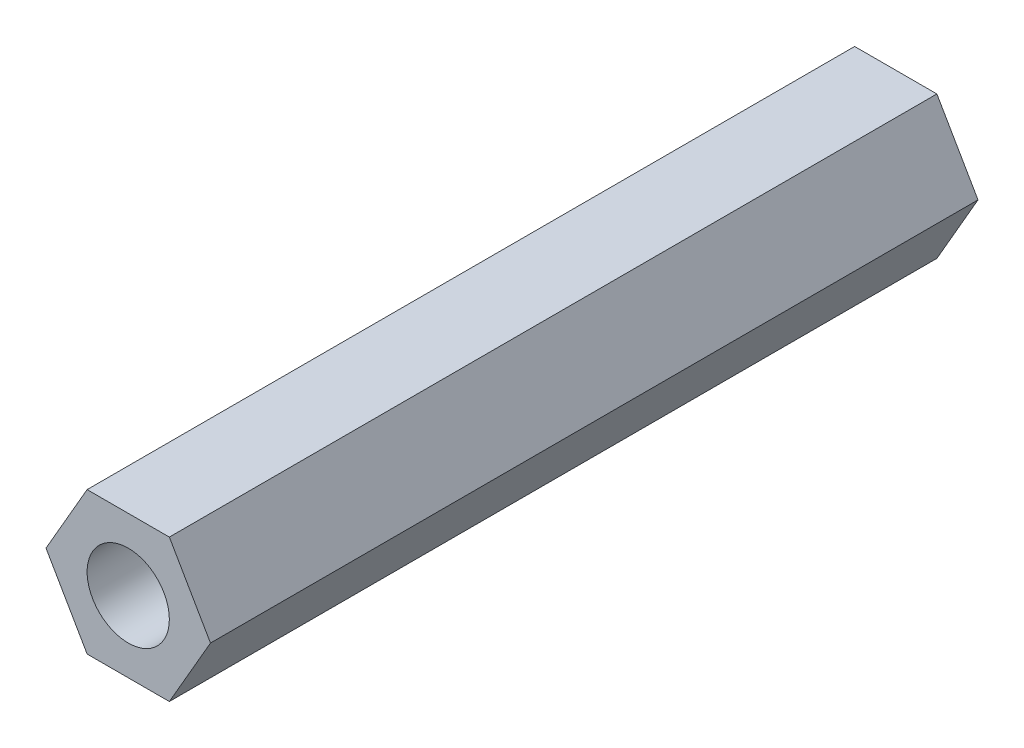
ISO-10303-21;
HEADER;
FILE_DESCRIPTION(('STEP AP214'),'2;1');
FILE_NAME('part.step','',(''),(''),'','','');
FILE_SCHEMA(('AUTOMOTIVE_DESIGN { 1 0 10303 214 1 1 1 1 }'));
ENDSEC;
DATA;
#1=APPLICATION_CONTEXT('core data for automotive mechanical design processes');
#2=APPLICATION_PROTOCOL_DEFINITION('international standard','automotive_design',2000,#1);
#3=PRODUCT_CONTEXT('',#1,'mechanical');
#4=PRODUCT('Part','Part','',(#3));
#5=PRODUCT_RELATED_PRODUCT_CATEGORY('part','',(#4));
#6=PRODUCT_DEFINITION_FORMATION('','',#4);
#7=PRODUCT_DEFINITION_CONTEXT('part definition',#1,'design');
#8=PRODUCT_DEFINITION('design','',#6,#7);
#9=PRODUCT_DEFINITION_SHAPE('','',#8);
#10=(LENGTH_UNIT() NAMED_UNIT(*) SI_UNIT(.MILLI.,.METRE.));
#11=(NAMED_UNIT(*) PLANE_ANGLE_UNIT() SI_UNIT($,.RADIAN.));
#12=(NAMED_UNIT(*) SI_UNIT($,.STERADIAN.) SOLID_ANGLE_UNIT());
#13=UNCERTAINTY_MEASURE_WITH_UNIT(LENGTH_MEASURE(1.E-05),#10,'distance_accuracy_value','');
#14=(GEOMETRIC_REPRESENTATION_CONTEXT(3) GLOBAL_UNCERTAINTY_ASSIGNED_CONTEXT((#13)) GLOBAL_UNIT_ASSIGNED_CONTEXT((#10,
#11,#12)) REPRESENTATION_CONTEXT('',''));
#15=CARTESIAN_POINT('',(0.,0.,0.));
#16=DIRECTION('',(0.,0.,1.));
#17=DIRECTION('',(1.,0.,0.));
#18=AXIS2_PLACEMENT_3D('',#15,#16,#17);
#19=CARTESIAN_POINT('',(0.,0.,28.));
#20=DIRECTION('',(0.,0.,1.));
#21=DIRECTION('',(1.,0.,0.));
#22=AXIS2_PLACEMENT_3D('',#19,#20,#21);
#23=PLANE('',#22);
#24=DIRECTION('',(0.499999999999999,0.866025403784439,0.));
#25=VECTOR('',#24,1.);
#26=CARTESIAN_POINT('',(1.5,-2.59807621135332,28.));
#27=LINE('',#26,#25);
#28=CARTESIAN_POINT('',(1.5,-2.59807621135332,28.));
#29=VERTEX_POINT('',#28);
#30=CARTESIAN_POINT('',(3.,0.,28.));
#31=VERTEX_POINT('',#30);
#32=EDGE_CURVE('E129',#29,#31,#27,.T.);
#33=ORIENTED_EDGE('',*,*,#32,.T.);
#34=DIRECTION('',(-0.5,0.866025403784439,0.));
#35=VECTOR('',#34,1.);
#36=CARTESIAN_POINT('',(3.,0.,28.));
#37=LINE('',#36,#35);
#38=CARTESIAN_POINT('',(1.5,2.59807621135332,28.));
#39=VERTEX_POINT('',#38);
#40=EDGE_CURVE('E87',#31,#39,#37,.T.);
#41=ORIENTED_EDGE('',*,*,#40,.T.);
#42=DIRECTION('',(-1.,0.,0.));
#43=VECTOR('',#42,1.);
#44=CARTESIAN_POINT('',(1.5,2.59807621135332,28.));
#45=LINE('',#44,#43);
#46=CARTESIAN_POINT('',(-1.5,2.59807621135332,28.));
#47=VERTEX_POINT('',#46);
#48=EDGE_CURVE('E100',#39,#47,#45,.T.);
#49=ORIENTED_EDGE('',*,*,#48,.T.);
#50=DIRECTION('',(-0.5,-0.866025403784439,0.));
#51=VECTOR('',#50,1.);
#52=CARTESIAN_POINT('',(-1.5,2.59807621135332,28.));
#53=LINE('',#52,#51);
#54=CARTESIAN_POINT('',(-3.,0.,28.));
#55=VERTEX_POINT('',#54);
#56=EDGE_CURVE('E94',#47,#55,#53,.T.);
#57=ORIENTED_EDGE('',*,*,#56,.T.);
#58=DIRECTION('',(0.5,-0.866025403784439,0.));
#59=VECTOR('',#58,1.);
#60=CARTESIAN_POINT('',(-3.,0.,28.));
#61=LINE('',#60,#59);
#62=CARTESIAN_POINT('',(-1.5,-2.59807621135332,28.));
#63=VERTEX_POINT('',#62);
#64=EDGE_CURVE('E98',#55,#63,#61,.T.);
#65=ORIENTED_EDGE('',*,*,#64,.T.);
#66=DIRECTION('',(1.,0.,0.));
#67=VECTOR('',#66,1.);
#68=CARTESIAN_POINT('',(-1.5,-2.59807621135332,28.));
#69=LINE('',#68,#67);
#70=EDGE_CURVE('E50',#63,#29,#69,.T.);
#71=ORIENTED_EDGE('',*,*,#70,.T.);
#72=EDGE_LOOP('',(#33,#41,#49,#57,#65,#71));
#73=FACE_BOUND('',#72,.T.);
#74=CARTESIAN_POINT('',(0.,0.,28.));
#75=DIRECTION('',(0.,0.,1.));
#76=DIRECTION('',(1.,0.,0.));
#77=AXIS2_PLACEMENT_3D('',#74,#75,#76);
#78=CIRCLE('',#77,1.5);
#79=CARTESIAN_POINT('',(1.5,0.,28.));
#80=VERTEX_POINT('',#79);
#81=EDGE_CURVE('E122',#80,#80,#78,.T.);
#82=ORIENTED_EDGE('',*,*,#81,.F.);
#83=EDGE_LOOP('',(#82));
#84=FACE_BOUND('',#83,.T.);
#85=ADVANCED_FACE('F33',(#73,#84),#23,.T.);
#86=CARTESIAN_POINT('',(0.,0.,0.));
#87=DIRECTION('',(0.,0.,1.));
#88=DIRECTION('',(1.,0.,0.));
#89=AXIS2_PLACEMENT_3D('',#86,#87,#88);
#90=PLANE('',#89);
#91=DIRECTION('',(0.499999999999999,0.866025403784439,0.));
#92=VECTOR('',#91,1.);
#93=CARTESIAN_POINT('',(1.5,-2.59807621135332,0.));
#94=LINE('',#93,#92);
#95=CARTESIAN_POINT('',(1.5,-2.59807621135332,0.));
#96=VERTEX_POINT('',#95);
#97=CARTESIAN_POINT('',(3.,0.,0.));
#98=VERTEX_POINT('',#97);
#99=EDGE_CURVE('E118',#96,#98,#94,.T.);
#100=ORIENTED_EDGE('',*,*,#99,.F.);
#101=DIRECTION('',(1.,0.,0.));
#102=VECTOR('',#101,1.);
#103=CARTESIAN_POINT('',(-1.5,-2.59807621135332,0.));
#104=LINE('',#103,#102);
#105=CARTESIAN_POINT('',(-1.5,-2.59807621135332,0.));
#106=VERTEX_POINT('',#105);
#107=EDGE_CURVE('E79',#106,#96,#104,.T.);
#108=ORIENTED_EDGE('',*,*,#107,.F.);
#109=DIRECTION('',(0.5,-0.866025403784439,0.));
#110=VECTOR('',#109,1.);
#111=CARTESIAN_POINT('',(-3.,0.,0.));
#112=LINE('',#111,#110);
#113=CARTESIAN_POINT('',(-3.,0.,0.));
#114=VERTEX_POINT('',#113);
#115=EDGE_CURVE('E73',#114,#106,#112,.T.);
#116=ORIENTED_EDGE('',*,*,#115,.F.);
#117=DIRECTION('',(-0.5,-0.866025403784439,0.));
#118=VECTOR('',#117,1.);
#119=CARTESIAN_POINT('',(-1.5,2.59807621135332,0.));
#120=LINE('',#119,#118);
#121=CARTESIAN_POINT('',(-1.5,2.59807621135332,0.));
#122=VERTEX_POINT('',#121);
#123=EDGE_CURVE('E108',#122,#114,#120,.T.);
#124=ORIENTED_EDGE('',*,*,#123,.F.);
#125=DIRECTION('',(-1.,0.,0.));
#126=VECTOR('',#125,1.);
#127=CARTESIAN_POINT('',(1.5,2.59807621135332,0.));
#128=LINE('',#127,#126);
#129=CARTESIAN_POINT('',(1.5,2.59807621135332,0.));
#130=VERTEX_POINT('',#129);
#131=EDGE_CURVE('E124',#130,#122,#128,.T.);
#132=ORIENTED_EDGE('',*,*,#131,.F.);
#133=DIRECTION('',(-0.5,0.866025403784439,0.));
#134=VECTOR('',#133,1.);
#135=CARTESIAN_POINT('',(3.,0.,0.));
#136=LINE('',#135,#134);
#137=EDGE_CURVE('E121',#98,#130,#136,.T.);
#138=ORIENTED_EDGE('',*,*,#137,.F.);
#139=EDGE_LOOP('',(#100,#108,#116,#124,#132,#138));
#140=FACE_BOUND('',#139,.T.);
#141=CARTESIAN_POINT('',(0.,0.,0.));
#142=DIRECTION('',(0.,0.,1.));
#143=DIRECTION('',(1.,0.,0.));
#144=AXIS2_PLACEMENT_3D('',#141,#142,#143);
#145=CIRCLE('',#144,1.5);
#146=CARTESIAN_POINT('',(1.5,0.,0.));
#147=VERTEX_POINT('',#146);
#148=EDGE_CURVE('E222',#147,#147,#145,.T.);
#149=ORIENTED_EDGE('',*,*,#148,.T.);
#150=EDGE_LOOP('',(#149));
#151=FACE_BOUND('',#150,.T.);
#152=ADVANCED_FACE('F138',(#140,#151),#90,.F.);
#153=CARTESIAN_POINT('',(1.5,-2.59807621135332,28.));
#154=DIRECTION('',(-0.866025403784439,0.499999999999999,0.));
#155=DIRECTION('',(-0.499999999999999,-0.866025403784439,0.));
#156=AXIS2_PLACEMENT_3D('',#153,#154,#155);
#157=PLANE('',#156);
#158=ORIENTED_EDGE('',*,*,#99,.T.);
#159=DIRECTION('',(0.,0.,-1.));
#160=VECTOR('',#159,1.);
#161=CARTESIAN_POINT('',(3.,0.,28.));
#162=LINE('',#161,#160);
#163=EDGE_CURVE('E11',#31,#98,#162,.T.);
#164=ORIENTED_EDGE('',*,*,#163,.F.);
#165=ORIENTED_EDGE('',*,*,#32,.F.);
#166=DIRECTION('',(0.,0.,-1.));
#167=VECTOR('',#166,1.);
#168=CARTESIAN_POINT('',(1.5,-2.59807621135332,28.));
#169=LINE('',#168,#167);
#170=EDGE_CURVE('E114',#29,#96,#169,.T.);
#171=ORIENTED_EDGE('',*,*,#170,.T.);
#172=EDGE_LOOP('',(#158,#164,#165,#171));
#173=FACE_BOUND('',#172,.T.);
#174=ADVANCED_FACE('F35',(#173),#157,.F.);
#175=CARTESIAN_POINT('',(3.,0.,28.));
#176=DIRECTION('',(-0.866025403784439,-0.5,0.));
#177=DIRECTION('',(0.5,-0.866025403784439,0.));
#178=AXIS2_PLACEMENT_3D('',#175,#176,#177);
#179=PLANE('',#178);
#180=ORIENTED_EDGE('',*,*,#137,.T.);
#181=DIRECTION('',(0.,0.,-1.));
#182=VECTOR('',#181,1.);
#183=CARTESIAN_POINT('',(1.5,2.59807621135332,28.));
#184=LINE('',#183,#182);
#185=EDGE_CURVE('E42',#39,#130,#184,.T.);
#186=ORIENTED_EDGE('',*,*,#185,.F.);
#187=ORIENTED_EDGE('',*,*,#40,.F.);
#188=ORIENTED_EDGE('',*,*,#163,.T.);
#189=EDGE_LOOP('',(#180,#186,#187,#188));
#190=FACE_BOUND('',#189,.T.);
#191=ADVANCED_FACE('F163',(#190),#179,.F.);
#192=CARTESIAN_POINT('',(1.5,2.59807621135332,28.));
#193=DIRECTION('',(0.,-1.,0.));
#194=DIRECTION('',(0.,0.,-1.));
#195=AXIS2_PLACEMENT_3D('',#192,#193,#194);
#196=PLANE('',#195);
#197=ORIENTED_EDGE('',*,*,#131,.T.);
#198=DIRECTION('',(0.,0.,-1.));
#199=VECTOR('',#198,1.);
#200=CARTESIAN_POINT('',(-1.5,2.59807621135332,28.));
#201=LINE('',#200,#199);
#202=EDGE_CURVE('E109',#47,#122,#201,.T.);
#203=ORIENTED_EDGE('',*,*,#202,.F.);
#204=ORIENTED_EDGE('',*,*,#48,.F.);
#205=ORIENTED_EDGE('',*,*,#185,.T.);
#206=EDGE_LOOP('',(#197,#203,#204,#205));
#207=FACE_BOUND('',#206,.T.);
#208=ADVANCED_FACE('F135',(#207),#196,.F.);
#209=CARTESIAN_POINT('',(-1.5,2.59807621135332,28.));
#210=DIRECTION('',(0.866025403784439,-0.5,0.));
#211=DIRECTION('',(0.5,0.866025403784439,0.));
#212=AXIS2_PLACEMENT_3D('',#209,#210,#211);
#213=PLANE('',#212);
#214=ORIENTED_EDGE('',*,*,#123,.T.);
#215=DIRECTION('',(0.,0.,-1.));
#216=VECTOR('',#215,1.);
#217=CARTESIAN_POINT('',(-3.,0.,28.));
#218=LINE('',#217,#216);
#219=EDGE_CURVE('E105',#55,#114,#218,.T.);
#220=ORIENTED_EDGE('',*,*,#219,.F.);
#221=ORIENTED_EDGE('',*,*,#56,.F.);
#222=ORIENTED_EDGE('',*,*,#202,.T.);
#223=EDGE_LOOP('',(#214,#220,#221,#222));
#224=FACE_BOUND('',#223,.T.);
#225=ADVANCED_FACE('F106',(#224),#213,.F.);
#226=CARTESIAN_POINT('',(-3.,0.,28.));
#227=DIRECTION('',(0.866025403784439,0.5,0.));
#228=DIRECTION('',(-0.5,0.866025403784439,0.));
#229=AXIS2_PLACEMENT_3D('',#226,#227,#228);
#230=PLANE('',#229);
#231=ORIENTED_EDGE('',*,*,#115,.T.);
#232=DIRECTION('',(0.,0.,-1.));
#233=VECTOR('',#232,1.);
#234=CARTESIAN_POINT('',(-1.5,-2.59807621135332,28.));
#235=LINE('',#234,#233);
#236=EDGE_CURVE('E110',#63,#106,#235,.T.);
#237=ORIENTED_EDGE('',*,*,#236,.F.);
#238=ORIENTED_EDGE('',*,*,#64,.F.);
#239=ORIENTED_EDGE('',*,*,#219,.T.);
#240=EDGE_LOOP('',(#231,#237,#238,#239));
#241=FACE_BOUND('',#240,.T.);
#242=ADVANCED_FACE('F112',(#241),#230,.F.);
#243=CARTESIAN_POINT('',(-1.5,-2.59807621135332,28.));
#244=DIRECTION('',(0.,1.,0.));
#245=DIRECTION('',(0.,0.,1.));
#246=AXIS2_PLACEMENT_3D('',#243,#244,#245);
#247=PLANE('',#246);
#248=ORIENTED_EDGE('',*,*,#107,.T.);
#249=ORIENTED_EDGE('',*,*,#170,.F.);
#250=ORIENTED_EDGE('',*,*,#70,.F.);
#251=ORIENTED_EDGE('',*,*,#236,.T.);
#252=EDGE_LOOP('',(#248,#249,#250,#251));
#253=FACE_BOUND('',#252,.T.);
#254=ADVANCED_FACE('F143',(#253),#247,.F.);
#255=CARTESIAN_POINT('',(0.,0.,28.));
#256=DIRECTION('',(0.,0.,-1.));
#257=DIRECTION('',(-1.,0.,0.));
#258=AXIS2_PLACEMENT_3D('',#255,#256,#257);
#259=CYLINDRICAL_SURFACE('',#258,1.5);
#260=ORIENTED_EDGE('',*,*,#81,.T.);
#261=EDGE_LOOP('',(#260));
#262=FACE_BOUND('',#261,.T.);
#263=ORIENTED_EDGE('',*,*,#148,.F.);
#264=EDGE_LOOP('',(#263));
#265=FACE_BOUND('',#264,.T.);
#266=ADVANCED_FACE('F145',(#262,#265),#259,.F.);
#267=CLOSED_SHELL('',(#85,#152,#174,#191,#208,#225,#242,#254,#266));
#268=MANIFOLD_SOLID_BREP('B2',#267);
#269=ADVANCED_BREP_SHAPE_REPRESENTATION('',(#18,#268),#14);
#270=SHAPE_DEFINITION_REPRESENTATION(#9,#269);
ENDSEC;
END-ISO-10303-21;
